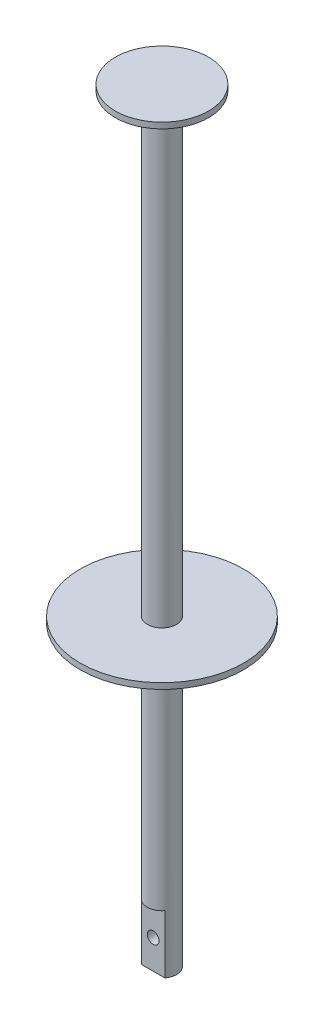
ISO-10303-21;
HEADER;
FILE_DESCRIPTION(('STEP AP214'),'2;1');
FILE_NAME('part.step','',(''),(''),'','','');
FILE_SCHEMA(('AUTOMOTIVE_DESIGN { 1 0 10303 214 1 1 1 1 }'));
ENDSEC;
DATA;
#1=APPLICATION_CONTEXT('core data for automotive mechanical design processes');
#2=APPLICATION_PROTOCOL_DEFINITION('international standard','automotive_design',2000,#1);
#3=PRODUCT_CONTEXT('',#1,'mechanical');
#4=PRODUCT('Part','Part','',(#3));
#5=PRODUCT_RELATED_PRODUCT_CATEGORY('part','',(#4));
#6=PRODUCT_DEFINITION_FORMATION('','',#4);
#7=PRODUCT_DEFINITION_CONTEXT('part definition',#1,'design');
#8=PRODUCT_DEFINITION('design','',#6,#7);
#9=PRODUCT_DEFINITION_SHAPE('','',#8);
#10=(LENGTH_UNIT() NAMED_UNIT(*) SI_UNIT(.MILLI.,.METRE.));
#11=(NAMED_UNIT(*) PLANE_ANGLE_UNIT() SI_UNIT($,.RADIAN.));
#12=(NAMED_UNIT(*) SI_UNIT($,.STERADIAN.) SOLID_ANGLE_UNIT());
#13=UNCERTAINTY_MEASURE_WITH_UNIT(LENGTH_MEASURE(1.E-05),#10,'distance_accuracy_value','');
#14=(GEOMETRIC_REPRESENTATION_CONTEXT(3) GLOBAL_UNCERTAINTY_ASSIGNED_CONTEXT((#13)) GLOBAL_UNIT_ASSIGNED_CONTEXT((#10,
#11,#12)) REPRESENTATION_CONTEXT('',''));
#15=CARTESIAN_POINT('',(0.,0.,0.));
#16=DIRECTION('',(0.,0.,1.));
#17=DIRECTION('',(1.,0.,0.));
#18=AXIS2_PLACEMENT_3D('',#15,#16,#17);
#19=CARTESIAN_POINT('',(0.,1.,0.));
#20=DIRECTION('',(0.,-1.,0.));
#21=DIRECTION('',(0.,0.,-1.));
#22=AXIS2_PLACEMENT_3D('',#19,#20,#21);
#23=CYLINDRICAL_SURFACE('',#22,8.);
#24=CARTESIAN_POINT('',(0.,1.,0.));
#25=DIRECTION('',(0.,1.,0.));
#26=DIRECTION('',(0.,0.,1.));
#27=AXIS2_PLACEMENT_3D('',#24,#25,#26);
#28=CIRCLE('',#27,8.);
#29=CARTESIAN_POINT('',(0.,1.,8.));
#30=VERTEX_POINT('',#29);
#31=EDGE_CURVE('E118',#30,#30,#28,.T.);
#32=ORIENTED_EDGE('',*,*,#31,.F.);
#33=EDGE_LOOP('',(#32));
#34=FACE_BOUND('',#33,.T.);
#35=CARTESIAN_POINT('',(0.,0.,0.));
#36=DIRECTION('',(0.,1.,0.));
#37=DIRECTION('',(0.,0.,1.));
#38=AXIS2_PLACEMENT_3D('',#35,#36,#37);
#39=CIRCLE('',#38,8.);
#40=CARTESIAN_POINT('',(0.,0.,8.));
#41=VERTEX_POINT('',#40);
#42=EDGE_CURVE('E114',#41,#41,#39,.T.);
#43=ORIENTED_EDGE('',*,*,#42,.T.);
#44=EDGE_LOOP('',(#43));
#45=FACE_BOUND('',#44,.T.);
#46=ADVANCED_FACE('F39',(#34,#45),#23,.T.);
#47=CARTESIAN_POINT('',(0.,1.,0.));
#48=DIRECTION('',(0.,1.,0.));
#49=DIRECTION('',(0.,0.,1.));
#50=AXIS2_PLACEMENT_3D('',#47,#48,#49);
#51=PLANE('',#50);
#52=ORIENTED_EDGE('',*,*,#31,.T.);
#53=EDGE_LOOP('',(#52));
#54=FACE_BOUND('',#53,.T.);
#55=ADVANCED_FACE('F178',(#54),#51,.T.);
#56=CARTESIAN_POINT('',(0.,0.,0.));
#57=DIRECTION('',(0.,1.,0.));
#58=DIRECTION('',(0.,0.,1.));
#59=AXIS2_PLACEMENT_3D('',#56,#57,#58);
#60=PLANE('',#59);
#61=CARTESIAN_POINT('',(0.,0.,0.));
#62=DIRECTION('',(0.,-1.,0.));
#63=DIRECTION('',(0.,0.,-1.));
#64=AXIS2_PLACEMENT_3D('',#61,#62,#63);
#65=CIRCLE('',#64,2.5);
#66=CARTESIAN_POINT('',(0.,0.,-2.5));
#67=VERTEX_POINT('',#66);
#68=EDGE_CURVE('E113',#67,#67,#65,.T.);
#69=ORIENTED_EDGE('',*,*,#68,.F.);
#70=EDGE_LOOP('',(#69));
#71=FACE_BOUND('',#70,.T.);
#72=ORIENTED_EDGE('',*,*,#42,.F.);
#73=EDGE_LOOP('',(#72));
#74=FACE_BOUND('',#73,.T.);
#75=ADVANCED_FACE('F183',(#71,#74),#60,.F.);
#76=CARTESIAN_POINT('',(0.,-130.,0.));
#77=DIRECTION('',(0.,1.,0.));
#78=DIRECTION('',(0.,0.,1.));
#79=AXIS2_PLACEMENT_3D('',#76,#77,#78);
#80=CYLINDRICAL_SURFACE('',#79,2.5);
#81=CARTESIAN_POINT('',(0.,-78.,0.));
#82=DIRECTION('',(0.,1.,0.));
#83=DIRECTION('',(0.,0.,1.));
#84=AXIS2_PLACEMENT_3D('',#81,#82,#83);
#85=CIRCLE('',#84,2.5);
#86=CARTESIAN_POINT('',(0.,-78.,2.5));
#87=VERTEX_POINT('',#86);
#88=EDGE_CURVE('E42',#87,#87,#85,.T.);
#89=ORIENTED_EDGE('',*,*,#88,.T.);
#90=EDGE_LOOP('',(#89));
#91=FACE_BOUND('',#90,.T.);
#92=ORIENTED_EDGE('',*,*,#68,.T.);
#93=EDGE_LOOP('',(#92));
#94=FACE_BOUND('',#93,.T.);
#95=ADVANCED_FACE('F160',(#91,#94),#80,.T.);
#96=CARTESIAN_POINT('',(0.,-78.,0.));
#97=DIRECTION('',(0.,-1.,0.));
#98=DIRECTION('',(0.,0.,-1.));
#99=AXIS2_PLACEMENT_3D('',#96,#97,#98);
#100=CYLINDRICAL_SURFACE('',#99,14.);
#101=CARTESIAN_POINT('',(0.,-78.,0.));
#102=DIRECTION('',(0.,1.,0.));
#103=DIRECTION('',(0.,0.,1.));
#104=AXIS2_PLACEMENT_3D('',#101,#102,#103);
#105=CIRCLE('',#104,14.);
#106=CARTESIAN_POINT('',(0.,-78.,14.));
#107=VERTEX_POINT('',#106);
#108=EDGE_CURVE('E151',#107,#107,#105,.T.);
#109=ORIENTED_EDGE('',*,*,#108,.F.);
#110=EDGE_LOOP('',(#109));
#111=FACE_BOUND('',#110,.T.);
#112=CARTESIAN_POINT('',(0.,-79.,0.));
#113=DIRECTION('',(0.,1.,0.));
#114=DIRECTION('',(0.,0.,1.));
#115=AXIS2_PLACEMENT_3D('',#112,#113,#114);
#116=CIRCLE('',#115,14.);
#117=CARTESIAN_POINT('',(0.,-79.,14.));
#118=VERTEX_POINT('',#117);
#119=EDGE_CURVE('E147',#118,#118,#116,.T.);
#120=ORIENTED_EDGE('',*,*,#119,.T.);
#121=EDGE_LOOP('',(#120));
#122=FACE_BOUND('',#121,.T.);
#123=ADVANCED_FACE('F166',(#111,#122),#100,.T.);
#124=CARTESIAN_POINT('',(0.,-78.,0.));
#125=DIRECTION('',(0.,1.,0.));
#126=DIRECTION('',(0.,0.,1.));
#127=AXIS2_PLACEMENT_3D('',#124,#125,#126);
#128=PLANE('',#127);
#129=ORIENTED_EDGE('',*,*,#88,.F.);
#130=EDGE_LOOP('',(#129));
#131=FACE_BOUND('',#130,.T.);
#132=ORIENTED_EDGE('',*,*,#108,.T.);
#133=EDGE_LOOP('',(#132));
#134=FACE_BOUND('',#133,.T.);
#135=ADVANCED_FACE('F163',(#131,#134),#128,.T.);
#136=CARTESIAN_POINT('',(0.,-79.,0.));
#137=DIRECTION('',(0.,1.,0.));
#138=DIRECTION('',(0.,0.,1.));
#139=AXIS2_PLACEMENT_3D('',#136,#137,#138);
#140=PLANE('',#139);
#141=CARTESIAN_POINT('',(0.,-79.,0.));
#142=DIRECTION('',(0.,1.,0.));
#143=DIRECTION('',(0.,0.,1.));
#144=AXIS2_PLACEMENT_3D('',#141,#142,#143);
#145=CIRCLE('',#144,2.5);
#146=CARTESIAN_POINT('',(0.,-79.,2.5));
#147=VERTEX_POINT('',#146);
#148=EDGE_CURVE('E11',#147,#147,#145,.T.);
#149=ORIENTED_EDGE('',*,*,#148,.T.);
#150=EDGE_LOOP('',(#149));
#151=FACE_BOUND('',#150,.T.);
#152=ORIENTED_EDGE('',*,*,#119,.F.);
#153=EDGE_LOOP('',(#152));
#154=FACE_BOUND('',#153,.T.);
#155=ADVANCED_FACE('F165',(#151,#154),#140,.F.);
#156=CARTESIAN_POINT('',(0.,-125.,-8.));
#157=DIRECTION('',(0.,0.,1.));
#158=DIRECTION('',(1.,0.,0.));
#159=AXIS2_PLACEMENT_3D('',#156,#157,#158);
#160=CYLINDRICAL_SURFACE('',#159,1.);
#161=CARTESIAN_POINT('',(0.,-125.,1.5));
#162=DIRECTION('',(0.,0.,1.));
#163=DIRECTION('',(1.,0.,0.));
#164=AXIS2_PLACEMENT_3D('',#161,#162,#163);
#165=CIRCLE('',#164,1.);
#166=CARTESIAN_POINT('',(0.999999999999998,-125.,1.5));
#167=VERTEX_POINT('',#166);
#168=EDGE_CURVE('E143',#167,#167,#165,.T.);
#169=ORIENTED_EDGE('',*,*,#168,.T.);
#170=EDGE_LOOP('',(#169));
#171=FACE_BOUND('',#170,.T.);
#172=CARTESIAN_POINT('',(0.,-125.,-1.5));
#173=DIRECTION('',(0.,0.,1.));
#174=DIRECTION('',(1.,0.,0.));
#175=AXIS2_PLACEMENT_3D('',#172,#173,#174);
#176=CIRCLE('',#175,1.);
#177=CARTESIAN_POINT('',(0.999999999999998,-125.,-1.5));
#178=VERTEX_POINT('',#177);
#179=EDGE_CURVE('E97',#178,#178,#176,.T.);
#180=ORIENTED_EDGE('',*,*,#179,.F.);
#181=EDGE_LOOP('',(#180));
#182=FACE_BOUND('',#181,.T.);
#183=ADVANCED_FACE('F172',(#171,#182),#160,.F.);
#184=CARTESIAN_POINT('',(-8.,-120.,-1.5));
#185=DIRECTION('',(0.,1.,0.));
#186=DIRECTION('',(0.,0.,1.));
#187=AXIS2_PLACEMENT_3D('',#184,#185,#186);
#188=PLANE('',#187);
#189=DIRECTION('',(1.,0.,0.));
#190=VECTOR('',#189,1.);
#191=CARTESIAN_POINT('',(-8.,-120.,-1.5));
#192=LINE('',#191,#190);
#193=CARTESIAN_POINT('',(-2.,-120.,-1.5));
#194=VERTEX_POINT('',#193);
#195=CARTESIAN_POINT('',(2.,-120.,-1.5));
#196=VERTEX_POINT('',#195);
#197=EDGE_CURVE('E84',#194,#196,#192,.T.);
#198=ORIENTED_EDGE('',*,*,#197,.F.);
#199=CARTESIAN_POINT('',(0.,-120.,0.));
#200=DIRECTION('',(0.,1.,0.));
#201=DIRECTION('',(0.,0.,1.));
#202=AXIS2_PLACEMENT_3D('',#199,#200,#201);
#203=CIRCLE('',#202,2.5);
#204=EDGE_CURVE('E95',#196,#194,#203,.T.);
#205=ORIENTED_EDGE('',*,*,#204,.F.);
#206=EDGE_LOOP('',(#198,#205));
#207=FACE_BOUND('',#206,.T.);
#208=ADVANCED_FACE('F94',(#207),#188,.F.);
#209=CARTESIAN_POINT('',(-8.,-130.,-1.5));
#210=DIRECTION('',(0.,0.,1.));
#211=DIRECTION('',(1.,0.,0.));
#212=AXIS2_PLACEMENT_3D('',#209,#210,#211);
#213=PLANE('',#212);
#214=ORIENTED_EDGE('',*,*,#179,.T.);
#215=EDGE_LOOP('',(#214));
#216=FACE_BOUND('',#215,.T.);
#217=DIRECTION('',(-1.,0.,0.));
#218=VECTOR('',#217,1.);
#219=CARTESIAN_POINT('',(0.,-130.,-1.5));
#220=LINE('',#219,#218);
#221=CARTESIAN_POINT('',(2.,-130.,-1.5));
#222=VERTEX_POINT('',#221);
#223=CARTESIAN_POINT('',(-2.,-130.,-1.5));
#224=VERTEX_POINT('',#223);
#225=EDGE_CURVE('E85',#222,#224,#220,.T.);
#226=ORIENTED_EDGE('',*,*,#225,.T.);
#227=DIRECTION('',(0.,1.,0.));
#228=VECTOR('',#227,1.);
#229=CARTESIAN_POINT('',(-2.,-130.,-1.5));
#230=LINE('',#229,#228);
#231=EDGE_CURVE('E81',#194,#224,#230,.F.);
#232=ORIENTED_EDGE('',*,*,#231,.F.);
#233=ORIENTED_EDGE('',*,*,#197,.T.);
#234=DIRECTION('',(0.,1.,0.));
#235=VECTOR('',#234,1.);
#236=CARTESIAN_POINT('',(2.,-130.,-1.5));
#237=LINE('',#236,#235);
#238=EDGE_CURVE('E63',#222,#196,#237,.T.);
#239=ORIENTED_EDGE('',*,*,#238,.F.);
#240=EDGE_LOOP('',(#226,#232,#233,#239));
#241=FACE_BOUND('',#240,.T.);
#242=ADVANCED_FACE('F83',(#216,#241),#213,.F.);
#243=CARTESIAN_POINT('',(0.,-130.,0.));
#244=DIRECTION('',(0.,-1.,0.));
#245=DIRECTION('',(0.,0.,-1.));
#246=AXIS2_PLACEMENT_3D('',#243,#244,#245);
#247=PLANE('',#246);
#248=DIRECTION('',(1.,0.,0.));
#249=VECTOR('',#248,1.);
#250=CARTESIAN_POINT('',(0.,-130.,1.5));
#251=LINE('',#250,#249);
#252=CARTESIAN_POINT('',(-2.,-130.,1.5));
#253=VERTEX_POINT('',#252);
#254=CARTESIAN_POINT('',(2.,-130.,1.5));
#255=VERTEX_POINT('',#254);
#256=EDGE_CURVE('E103',#253,#255,#251,.T.);
#257=ORIENTED_EDGE('',*,*,#256,.F.);
#258=CARTESIAN_POINT('',(0.,-130.,0.));
#259=DIRECTION('',(0.,-1.,0.));
#260=DIRECTION('',(0.,0.,-1.));
#261=AXIS2_PLACEMENT_3D('',#258,#259,#260);
#262=CIRCLE('',#261,2.5);
#263=EDGE_CURVE('E126',#253,#224,#262,.T.);
#264=ORIENTED_EDGE('',*,*,#263,.T.);
#265=ORIENTED_EDGE('',*,*,#225,.F.);
#266=EDGE_CURVE('E119',#222,#255,#262,.T.);
#267=ORIENTED_EDGE('',*,*,#266,.T.);
#268=EDGE_LOOP('',(#257,#264,#265,#267));
#269=FACE_BOUND('',#268,.T.);
#270=ADVANCED_FACE('F199',(#269),#247,.T.);
#271=CARTESIAN_POINT('',(-8.,-120.,1.5));
#272=DIRECTION('',(0.,1.,0.));
#273=DIRECTION('',(0.,0.,1.));
#274=AXIS2_PLACEMENT_3D('',#271,#272,#273);
#275=PLANE('',#274);
#276=CARTESIAN_POINT('',(0.,-120.,0.));
#277=DIRECTION('',(0.,1.,0.));
#278=DIRECTION('',(0.,0.,1.));
#279=AXIS2_PLACEMENT_3D('',#276,#277,#278);
#280=CIRCLE('',#279,2.5);
#281=CARTESIAN_POINT('',(-2.,-120.,1.5));
#282=VERTEX_POINT('',#281);
#283=CARTESIAN_POINT('',(2.,-120.,1.5));
#284=VERTEX_POINT('',#283);
#285=EDGE_CURVE('E48',#282,#284,#280,.T.);
#286=ORIENTED_EDGE('',*,*,#285,.F.);
#287=DIRECTION('',(1.,0.,0.));
#288=VECTOR('',#287,1.);
#289=CARTESIAN_POINT('',(-8.,-120.,1.5));
#290=LINE('',#289,#288);
#291=EDGE_CURVE('E91',#282,#284,#290,.T.);
#292=ORIENTED_EDGE('',*,*,#291,.T.);
#293=EDGE_LOOP('',(#286,#292));
#294=FACE_BOUND('',#293,.T.);
#295=ADVANCED_FACE('F202',(#294),#275,.F.);
#296=CARTESIAN_POINT('',(-8.,-130.,1.5));
#297=DIRECTION('',(0.,0.,-1.));
#298=DIRECTION('',(-1.,0.,0.));
#299=AXIS2_PLACEMENT_3D('',#296,#297,#298);
#300=PLANE('',#299);
#301=ORIENTED_EDGE('',*,*,#168,.F.);
#302=EDGE_LOOP('',(#301));
#303=FACE_BOUND('',#302,.T.);
#304=ORIENTED_EDGE('',*,*,#256,.T.);
#305=DIRECTION('',(0.,1.,0.));
#306=VECTOR('',#305,1.);
#307=CARTESIAN_POINT('',(2.,-130.,1.5));
#308=LINE('',#307,#306);
#309=EDGE_CURVE('E131',#284,#255,#308,.F.);
#310=ORIENTED_EDGE('',*,*,#309,.F.);
#311=ORIENTED_EDGE('',*,*,#291,.F.);
#312=DIRECTION('',(0.,1.,0.));
#313=VECTOR('',#312,1.);
#314=CARTESIAN_POINT('',(-2.,-130.,1.5));
#315=LINE('',#314,#313);
#316=EDGE_CURVE('E55',#253,#282,#315,.T.);
#317=ORIENTED_EDGE('',*,*,#316,.F.);
#318=EDGE_LOOP('',(#304,#310,#311,#317));
#319=FACE_BOUND('',#318,.T.);
#320=ADVANCED_FACE('F209',(#303,#319),#300,.F.);
#321=ORIENTED_EDGE('',*,*,#316,.T.);
#322=ORIENTED_EDGE('',*,*,#285,.T.);
#323=ORIENTED_EDGE('',*,*,#309,.T.);
#324=ORIENTED_EDGE('',*,*,#266,.F.);
#325=ORIENTED_EDGE('',*,*,#238,.T.);
#326=ORIENTED_EDGE('',*,*,#204,.T.);
#327=ORIENTED_EDGE('',*,*,#231,.T.);
#328=ORIENTED_EDGE('',*,*,#263,.F.);
#329=EDGE_LOOP('',(#321,#322,#323,#324,#325,#326,#327,#328));
#330=FACE_BOUND('',#329,.T.);
#331=ORIENTED_EDGE('',*,*,#148,.F.);
#332=EDGE_LOOP('',(#331));
#333=FACE_BOUND('',#332,.T.);
#334=ADVANCED_FACE('F99',(#330,#333),#80,.T.);
#335=CLOSED_SHELL('',(#46,#55,#75,#95,#123,#135,#155,#183,#208,#242,#270,#295,#320,#334));
#336=MANIFOLD_SOLID_BREP('B2',#335);
#337=ADVANCED_BREP_SHAPE_REPRESENTATION('',(#18,#336),#14);
#338=SHAPE_DEFINITION_REPRESENTATION(#9,#337);
ENDSEC;
END-ISO-10303-21;
